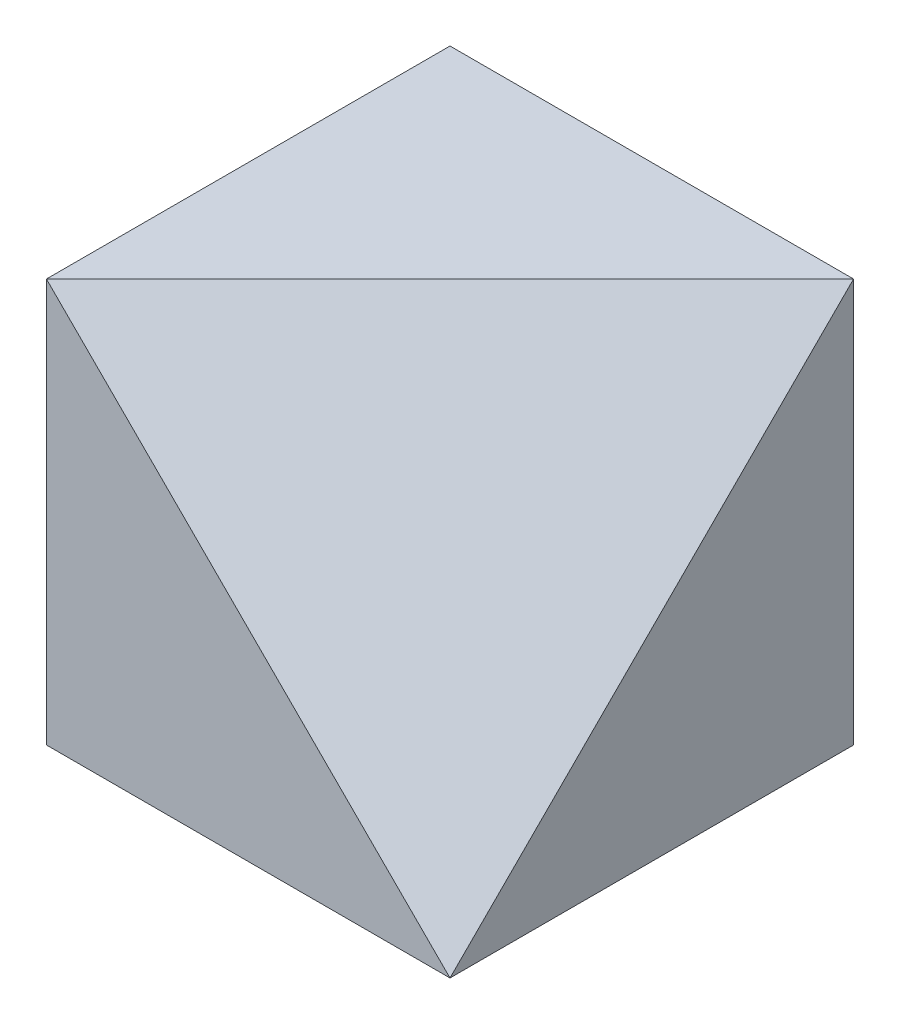
ISO-10303-21;
HEADER;
FILE_DESCRIPTION(('STEP AP214'),'2;1');
FILE_NAME('part.step','',(''),(''),'','','');
FILE_SCHEMA(('AUTOMOTIVE_DESIGN { 1 0 10303 214 1 1 1 1 }'));
ENDSEC;
DATA;
#1=APPLICATION_CONTEXT('core data for automotive mechanical design processes');
#2=APPLICATION_PROTOCOL_DEFINITION('international standard','automotive_design',2000,#1);
#3=PRODUCT_CONTEXT('',#1,'mechanical');
#4=PRODUCT('Part','Part','',(#3));
#5=PRODUCT_RELATED_PRODUCT_CATEGORY('part','',(#4));
#6=PRODUCT_DEFINITION_FORMATION('','',#4);
#7=PRODUCT_DEFINITION_CONTEXT('part definition',#1,'design');
#8=PRODUCT_DEFINITION('design','',#6,#7);
#9=PRODUCT_DEFINITION_SHAPE('','',#8);
#10=(LENGTH_UNIT() NAMED_UNIT(*) SI_UNIT(.MILLI.,.METRE.));
#11=(NAMED_UNIT(*) PLANE_ANGLE_UNIT() SI_UNIT($,.RADIAN.));
#12=(NAMED_UNIT(*) SI_UNIT($,.STERADIAN.) SOLID_ANGLE_UNIT());
#13=UNCERTAINTY_MEASURE_WITH_UNIT(LENGTH_MEASURE(1.E-05),#10,'distance_accuracy_value','');
#14=(GEOMETRIC_REPRESENTATION_CONTEXT(3) GLOBAL_UNCERTAINTY_ASSIGNED_CONTEXT((#13)) GLOBAL_UNIT_ASSIGNED_CONTEXT((#10,
#11,#12)) REPRESENTATION_CONTEXT('',''));
#15=CARTESIAN_POINT('',(0.,0.,0.));
#16=DIRECTION('',(0.,0.,1.));
#17=DIRECTION('',(1.,0.,0.));
#18=AXIS2_PLACEMENT_3D('',#15,#16,#17);
#19=CARTESIAN_POINT('',(0.,0.,100.));
#20=DIRECTION('',(1.,0.,0.));
#21=DIRECTION('',(0.,0.,-1.));
#22=AXIS2_PLACEMENT_3D('',#19,#20,#21);
#23=PLANE('',#22);
#24=DIRECTION('',(0.,-1.,0.));
#25=VECTOR('',#24,1.);
#26=CARTESIAN_POINT('',(0.,0.,0.));
#27=LINE('',#26,#25);
#28=CARTESIAN_POINT('',(0.,100.,0.));
#29=VERTEX_POINT('',#28);
#30=CARTESIAN_POINT('',(0.,0.,0.));
#31=VERTEX_POINT('',#30);
#32=EDGE_CURVE('E84',#29,#31,#27,.T.);
#33=ORIENTED_EDGE('',*,*,#32,.T.);
#34=DIRECTION('',(0.,0.,-1.));
#35=VECTOR('',#34,1.);
#36=CARTESIAN_POINT('',(0.,0.,100.));
#37=LINE('',#36,#35);
#38=CARTESIAN_POINT('',(0.,0.,100.));
#39=VERTEX_POINT('',#38);
#40=EDGE_CURVE('E11',#39,#31,#37,.T.);
#41=ORIENTED_EDGE('',*,*,#40,.F.);
#42=DIRECTION('',(0.,-1.,0.));
#43=VECTOR('',#42,1.);
#44=CARTESIAN_POINT('',(0.,0.,100.));
#45=LINE('',#44,#43);
#46=CARTESIAN_POINT('',(0.,100.,100.));
#47=VERTEX_POINT('',#46);
#48=EDGE_CURVE('E78',#47,#39,#45,.T.);
#49=ORIENTED_EDGE('',*,*,#48,.F.);
#50=DIRECTION('',(0.,0.,-1.));
#51=VECTOR('',#50,1.);
#52=CARTESIAN_POINT('',(0.,100.,100.));
#53=LINE('',#52,#51);
#54=EDGE_CURVE('E72',#47,#29,#53,.T.);
#55=ORIENTED_EDGE('',*,*,#54,.T.);
#56=EDGE_LOOP('',(#33,#41,#49,#55));
#57=FACE_BOUND('',#56,.T.);
#58=ADVANCED_FACE('F34',(#57),#23,.F.);
#59=CARTESIAN_POINT('',(0.,0.,100.));
#60=DIRECTION('',(0.,1.,0.));
#61=DIRECTION('',(0.,0.,1.));
#62=AXIS2_PLACEMENT_3D('',#59,#60,#61);
#63=PLANE('',#62);
#64=DIRECTION('',(1.,0.,0.));
#65=VECTOR('',#64,1.);
#66=CARTESIAN_POINT('',(0.,0.,0.));
#67=LINE('',#66,#65);
#68=CARTESIAN_POINT('',(100.,0.,0.));
#69=VERTEX_POINT('',#68);
#70=EDGE_CURVE('E63',#31,#69,#67,.T.);
#71=ORIENTED_EDGE('',*,*,#70,.T.);
#72=DIRECTION('',(0.,0.,-1.));
#73=VECTOR('',#72,1.);
#74=CARTESIAN_POINT('',(100.,0.,100.));
#75=LINE('',#74,#73);
#76=CARTESIAN_POINT('',(100.,0.,100.));
#77=VERTEX_POINT('',#76);
#78=EDGE_CURVE('E42',#77,#69,#75,.T.);
#79=ORIENTED_EDGE('',*,*,#78,.F.);
#80=DIRECTION('',(1.,0.,0.));
#81=VECTOR('',#80,1.);
#82=CARTESIAN_POINT('',(0.,0.,100.));
#83=LINE('',#82,#81);
#84=EDGE_CURVE('E86',#39,#77,#83,.T.);
#85=ORIENTED_EDGE('',*,*,#84,.F.);
#86=ORIENTED_EDGE('',*,*,#40,.T.);
#87=EDGE_LOOP('',(#71,#79,#85,#86));
#88=FACE_BOUND('',#87,.T.);
#89=ADVANCED_FACE('F101',(#88),#63,.F.);
#90=CARTESIAN_POINT('',(100.,0.,100.));
#91=DIRECTION('',(-1.,0.,0.));
#92=DIRECTION('',(0.,0.,1.));
#93=AXIS2_PLACEMENT_3D('',#90,#91,#92);
#94=PLANE('',#93);
#95=DIRECTION('',(0.,1.,0.));
#96=VECTOR('',#95,1.);
#97=CARTESIAN_POINT('',(100.,0.,0.));
#98=LINE('',#97,#96);
#99=CARTESIAN_POINT('',(100.,100.,0.));
#100=VERTEX_POINT('',#99);
#101=EDGE_CURVE('E79',#69,#100,#98,.T.);
#102=ORIENTED_EDGE('',*,*,#101,.T.);
#103=DIRECTION('',(0.,0.707106781186547,-0.707106781186547));
#104=VECTOR('',#103,1.);
#105=CARTESIAN_POINT('',(100.,100.,0.));
#106=LINE('',#105,#104);
#107=EDGE_CURVE('E91',#77,#100,#106,.T.);
#108=ORIENTED_EDGE('',*,*,#107,.F.);
#109=ORIENTED_EDGE('',*,*,#78,.T.);
#110=EDGE_LOOP('',(#102,#108,#109));
#111=FACE_BOUND('',#110,.T.);
#112=ADVANCED_FACE('F98',(#111),#94,.F.);
#113=CARTESIAN_POINT('',(0.,100.,100.));
#114=DIRECTION('',(0.,-1.,0.));
#115=DIRECTION('',(0.,0.,-1.));
#116=AXIS2_PLACEMENT_3D('',#113,#114,#115);
#117=PLANE('',#116);
#118=ORIENTED_EDGE('',*,*,#54,.F.);
#119=DIRECTION('',(-0.707106781186547,0.,0.707106781186547));
#120=VECTOR('',#119,1.);
#121=CARTESIAN_POINT('',(0.,100.,100.));
#122=LINE('',#121,#120);
#123=EDGE_CURVE('E50',#100,#47,#122,.T.);
#124=ORIENTED_EDGE('',*,*,#123,.F.);
#125=DIRECTION('',(-1.,0.,0.));
#126=VECTOR('',#125,1.);
#127=CARTESIAN_POINT('',(0.,100.,0.));
#128=LINE('',#127,#126);
#129=EDGE_CURVE('E69',#100,#29,#128,.T.);
#130=ORIENTED_EDGE('',*,*,#129,.T.);
#131=EDGE_LOOP('',(#118,#124,#130));
#132=FACE_BOUND('',#131,.T.);
#133=ADVANCED_FACE('F71',(#132),#117,.F.);
#134=CARTESIAN_POINT('',(0.,0.,100.));
#135=DIRECTION('',(0.,0.,-1.));
#136=DIRECTION('',(-1.,0.,0.));
#137=AXIS2_PLACEMENT_3D('',#134,#135,#136);
#138=PLANE('',#137);
#139=ORIENTED_EDGE('',*,*,#84,.T.);
#140=DIRECTION('',(0.707106781186547,-0.707106781186547,0.));
#141=VECTOR('',#140,1.);
#142=CARTESIAN_POINT('',(100.,0.,100.));
#143=LINE('',#142,#141);
#144=EDGE_CURVE('E103',#47,#77,#143,.T.);
#145=ORIENTED_EDGE('',*,*,#144,.F.);
#146=ORIENTED_EDGE('',*,*,#48,.T.);
#147=EDGE_LOOP('',(#139,#145,#146));
#148=FACE_BOUND('',#147,.T.);
#149=ADVANCED_FACE('F108',(#148),#138,.F.);
#150=CARTESIAN_POINT('',(0.,0.,0.));
#151=DIRECTION('',(0.,0.,-1.));
#152=DIRECTION('',(-1.,0.,0.));
#153=AXIS2_PLACEMENT_3D('',#150,#151,#152);
#154=PLANE('',#153);
#155=ORIENTED_EDGE('',*,*,#32,.F.);
#156=ORIENTED_EDGE('',*,*,#129,.F.);
#157=ORIENTED_EDGE('',*,*,#101,.F.);
#158=ORIENTED_EDGE('',*,*,#70,.F.);
#159=EDGE_LOOP('',(#155,#156,#157,#158));
#160=FACE_BOUND('',#159,.T.);
#161=ADVANCED_FACE('F88',(#160),#154,.T.);
#162=CARTESIAN_POINT('',(66.6666666666667,66.6666666666667,66.6666666666667));
#163=DIRECTION('',(-0.577350269189626,-0.577350269189626,-0.577350269189626));
#164=DIRECTION('',(-0.707106781186547,0.,0.707106781186547));
#165=AXIS2_PLACEMENT_3D('',#162,#163,#164);
#166=PLANE('',#165);
#167=ORIENTED_EDGE('',*,*,#144,.T.);
#168=ORIENTED_EDGE('',*,*,#107,.T.);
#169=ORIENTED_EDGE('',*,*,#123,.T.);
#170=EDGE_LOOP('',(#167,#168,#169));
#171=FACE_BOUND('',#170,.T.);
#172=ADVANCED_FACE('F104',(#171),#166,.F.);
#173=CLOSED_SHELL('',(#58,#89,#112,#133,#149,#161,#172));
#174=MANIFOLD_SOLID_BREP('B2',#173);
#175=ADVANCED_BREP_SHAPE_REPRESENTATION('',(#18,#174),#14);
#176=SHAPE_DEFINITION_REPRESENTATION(#9,#175);
ENDSEC;
END-ISO-10303-21;
